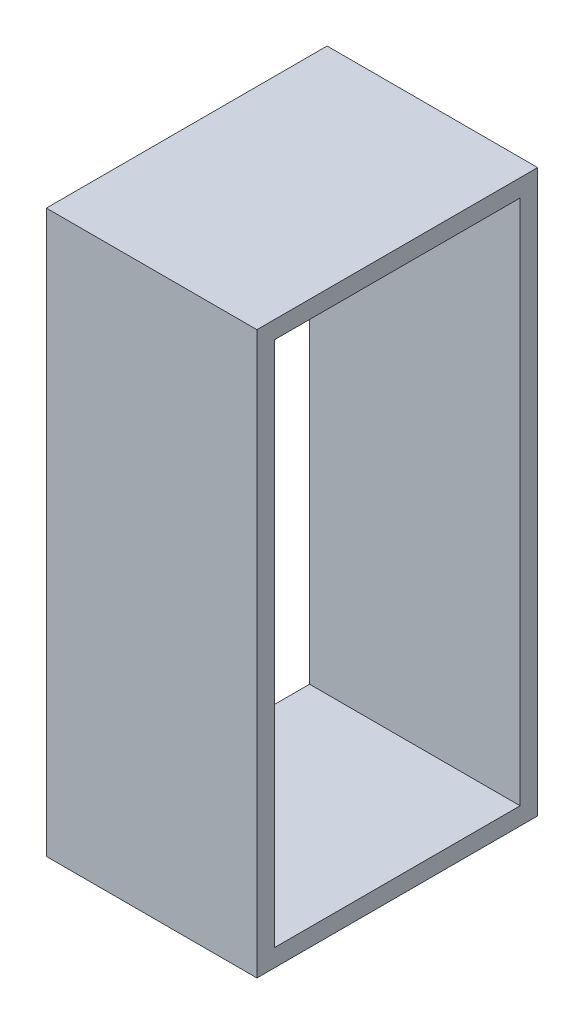
ISO-10303-21;
HEADER;
FILE_DESCRIPTION(('STEP AP214'),'2;1');
FILE_NAME('part.step','',(''),(''),'','','');
FILE_SCHEMA(('AUTOMOTIVE_DESIGN { 1 0 10303 214 1 1 1 1 }'));
ENDSEC;
DATA;
#1=APPLICATION_CONTEXT('core data for automotive mechanical design processes');
#2=APPLICATION_PROTOCOL_DEFINITION('international standard','automotive_design',2000,#1);
#3=PRODUCT_CONTEXT('',#1,'mechanical');
#4=PRODUCT('Part','Part','',(#3));
#5=PRODUCT_RELATED_PRODUCT_CATEGORY('part','',(#4));
#6=PRODUCT_DEFINITION_FORMATION('','',#4);
#7=PRODUCT_DEFINITION_CONTEXT('part definition',#1,'design');
#8=PRODUCT_DEFINITION('design','',#6,#7);
#9=PRODUCT_DEFINITION_SHAPE('','',#8);
#10=(LENGTH_UNIT() NAMED_UNIT(*) SI_UNIT(.MILLI.,.METRE.));
#11=(NAMED_UNIT(*) PLANE_ANGLE_UNIT() SI_UNIT($,.RADIAN.));
#12=(NAMED_UNIT(*) SI_UNIT($,.STERADIAN.) SOLID_ANGLE_UNIT());
#13=UNCERTAINTY_MEASURE_WITH_UNIT(LENGTH_MEASURE(1.E-05),#10,'distance_accuracy_value','');
#14=(GEOMETRIC_REPRESENTATION_CONTEXT(3) GLOBAL_UNCERTAINTY_ASSIGNED_CONTEXT((#13)) GLOBAL_UNIT_ASSIGNED_CONTEXT((#10,
#11,#12)) REPRESENTATION_CONTEXT('',''));
#15=CARTESIAN_POINT('',(0.,0.,0.));
#16=DIRECTION('',(0.,0.,1.));
#17=DIRECTION('',(1.,0.,0.));
#18=AXIS2_PLACEMENT_3D('',#15,#16,#17);
#19=CARTESIAN_POINT('',(19.05,0.,0.));
#20=DIRECTION('',(1.,0.,0.));
#21=DIRECTION('',(0.,0.,-1.));
#22=AXIS2_PLACEMENT_3D('',#19,#20,#21);
#23=PLANE('',#22);
#24=DIRECTION('',(0.,-1.,0.));
#25=VECTOR('',#24,1.);
#26=CARTESIAN_POINT('',(19.05,-25.4,12.7));
#27=LINE('',#26,#25);
#28=CARTESIAN_POINT('',(19.05,25.4,12.7));
#29=VERTEX_POINT('',#28);
#30=CARTESIAN_POINT('',(19.05,-25.4,12.7));
#31=VERTEX_POINT('',#30);
#32=EDGE_CURVE('E153',#29,#31,#27,.T.);
#33=ORIENTED_EDGE('',*,*,#32,.T.);
#34=DIRECTION('',(0.,0.,-1.));
#35=VECTOR('',#34,1.);
#36=CARTESIAN_POINT('',(19.05,-25.4,-12.7));
#37=LINE('',#36,#35);
#38=CARTESIAN_POINT('',(19.05,-25.4,-12.7));
#39=VERTEX_POINT('',#38);
#40=EDGE_CURVE('E157',#31,#39,#37,.T.);
#41=ORIENTED_EDGE('',*,*,#40,.T.);
#42=DIRECTION('',(0.,1.,0.));
#43=VECTOR('',#42,1.);
#44=CARTESIAN_POINT('',(19.05,-25.4,-12.7));
#45=LINE('',#44,#43);
#46=CARTESIAN_POINT('',(19.05,25.4,-12.7));
#47=VERTEX_POINT('',#46);
#48=EDGE_CURVE('E161',#39,#47,#45,.T.);
#49=ORIENTED_EDGE('',*,*,#48,.T.);
#50=DIRECTION('',(0.,0.,1.));
#51=VECTOR('',#50,1.);
#52=CARTESIAN_POINT('',(19.05,25.4,-12.7));
#53=LINE('',#52,#51);
#54=EDGE_CURVE('E164',#47,#29,#53,.T.);
#55=ORIENTED_EDGE('',*,*,#54,.T.);
#56=EDGE_LOOP('',(#33,#41,#49,#55));
#57=FACE_BOUND('',#56,.T.);
#58=DIRECTION('',(0.,0.,-1.));
#59=VECTOR('',#58,1.);
#60=CARTESIAN_POINT('',(19.05,-23.8125,-11.1125));
#61=LINE('',#60,#59);
#62=CARTESIAN_POINT('',(19.05,-23.8125,11.1125));
#63=VERTEX_POINT('',#62);
#64=CARTESIAN_POINT('',(19.05,-23.8125,-11.1125));
#65=VERTEX_POINT('',#64);
#66=EDGE_CURVE('E114',#63,#65,#61,.T.);
#67=ORIENTED_EDGE('',*,*,#66,.F.);
#68=DIRECTION('',(0.,-1.,0.));
#69=VECTOR('',#68,1.);
#70=CARTESIAN_POINT('',(19.05,-23.8125,11.1125));
#71=LINE('',#70,#69);
#72=CARTESIAN_POINT('',(19.05,23.8125,11.1125));
#73=VERTEX_POINT('',#72);
#74=EDGE_CURVE('E105',#73,#63,#71,.T.);
#75=ORIENTED_EDGE('',*,*,#74,.F.);
#76=DIRECTION('',(0.,0.,1.));
#77=VECTOR('',#76,1.);
#78=CARTESIAN_POINT('',(19.05,23.8125,-11.1125));
#79=LINE('',#78,#77);
#80=CARTESIAN_POINT('',(19.05,23.8125,-11.1125));
#81=VERTEX_POINT('',#80);
#82=EDGE_CURVE('E131',#81,#73,#79,.T.);
#83=ORIENTED_EDGE('',*,*,#82,.F.);
#84=DIRECTION('',(0.,1.,0.));
#85=VECTOR('',#84,1.);
#86=CARTESIAN_POINT('',(19.05,-23.8125,-11.1125));
#87=LINE('',#86,#85);
#88=EDGE_CURVE('E127',#65,#81,#87,.T.);
#89=ORIENTED_EDGE('',*,*,#88,.F.);
#90=EDGE_LOOP('',(#67,#75,#83,#89));
#91=FACE_BOUND('',#90,.T.);
#92=ADVANCED_FACE('F39',(#57,#91),#23,.T.);
#93=CARTESIAN_POINT('',(0.,0.,0.));
#94=DIRECTION('',(1.,0.,0.));
#95=DIRECTION('',(0.,0.,-1.));
#96=AXIS2_PLACEMENT_3D('',#93,#94,#95);
#97=PLANE('',#96);
#98=DIRECTION('',(0.,-1.,0.));
#99=VECTOR('',#98,1.);
#100=CARTESIAN_POINT('',(0.,-25.4,12.7));
#101=LINE('',#100,#99);
#102=CARTESIAN_POINT('',(0.,25.4,12.7));
#103=VERTEX_POINT('',#102);
#104=CARTESIAN_POINT('',(0.,-25.4,12.7));
#105=VERTEX_POINT('',#104);
#106=EDGE_CURVE('E123',#103,#105,#101,.T.);
#107=ORIENTED_EDGE('',*,*,#106,.F.);
#108=DIRECTION('',(0.,0.,1.));
#109=VECTOR('',#108,1.);
#110=CARTESIAN_POINT('',(0.,25.4,-12.7));
#111=LINE('',#110,#109);
#112=CARTESIAN_POINT('',(0.,25.4,-12.7));
#113=VERTEX_POINT('',#112);
#114=EDGE_CURVE('E158',#113,#103,#111,.T.);
#115=ORIENTED_EDGE('',*,*,#114,.F.);
#116=DIRECTION('',(0.,1.,0.));
#117=VECTOR('',#116,1.);
#118=CARTESIAN_POINT('',(0.,-25.4,-12.7));
#119=LINE('',#118,#117);
#120=CARTESIAN_POINT('',(0.,-25.4,-12.7));
#121=VERTEX_POINT('',#120);
#122=EDGE_CURVE('E174',#121,#113,#119,.T.);
#123=ORIENTED_EDGE('',*,*,#122,.F.);
#124=DIRECTION('',(0.,0.,-1.));
#125=VECTOR('',#124,1.);
#126=CARTESIAN_POINT('',(0.,-25.4,-12.7));
#127=LINE('',#126,#125);
#128=EDGE_CURVE('E171',#105,#121,#127,.T.);
#129=ORIENTED_EDGE('',*,*,#128,.F.);
#130=EDGE_LOOP('',(#107,#115,#123,#129));
#131=FACE_BOUND('',#130,.T.);
#132=DIRECTION('',(0.,-1.,0.));
#133=VECTOR('',#132,1.);
#134=CARTESIAN_POINT('',(0.,-23.8125,11.1125));
#135=LINE('',#134,#133);
#136=CARTESIAN_POINT('',(0.,23.8125,11.1125));
#137=VERTEX_POINT('',#136);
#138=CARTESIAN_POINT('',(0.,-23.8125,11.1125));
#139=VERTEX_POINT('',#138);
#140=EDGE_CURVE('E63',#137,#139,#135,.T.);
#141=ORIENTED_EDGE('',*,*,#140,.T.);
#142=DIRECTION('',(0.,0.,-1.));
#143=VECTOR('',#142,1.);
#144=CARTESIAN_POINT('',(0.,-23.8125,-11.1125));
#145=LINE('',#144,#143);
#146=CARTESIAN_POINT('',(0.,-23.8125,-11.1125));
#147=VERTEX_POINT('',#146);
#148=EDGE_CURVE('E121',#139,#147,#145,.T.);
#149=ORIENTED_EDGE('',*,*,#148,.T.);
#150=DIRECTION('',(0.,1.,0.));
#151=VECTOR('',#150,1.);
#152=CARTESIAN_POINT('',(0.,-23.8125,-11.1125));
#153=LINE('',#152,#151);
#154=CARTESIAN_POINT('',(0.,23.8125,-11.1125));
#155=VERTEX_POINT('',#154);
#156=EDGE_CURVE('E140',#147,#155,#153,.T.);
#157=ORIENTED_EDGE('',*,*,#156,.T.);
#158=DIRECTION('',(0.,0.,1.));
#159=VECTOR('',#158,1.);
#160=CARTESIAN_POINT('',(0.,23.8125,-11.1125));
#161=LINE('',#160,#159);
#162=EDGE_CURVE('E115',#155,#137,#161,.T.);
#163=ORIENTED_EDGE('',*,*,#162,.T.);
#164=EDGE_LOOP('',(#141,#149,#157,#163));
#165=FACE_BOUND('',#164,.T.);
#166=ADVANCED_FACE('F197',(#131,#165),#97,.F.);
#167=CARTESIAN_POINT('',(19.05,-25.4,12.7));
#168=DIRECTION('',(0.,0.,-1.));
#169=DIRECTION('',(-1.,0.,0.));
#170=AXIS2_PLACEMENT_3D('',#167,#168,#169);
#171=PLANE('',#170);
#172=ORIENTED_EDGE('',*,*,#106,.T.);
#173=DIRECTION('',(-1.,0.,0.));
#174=VECTOR('',#173,1.);
#175=CARTESIAN_POINT('',(19.05,-25.4,12.7));
#176=LINE('',#175,#174);
#177=EDGE_CURVE('E11',#31,#105,#176,.T.);
#178=ORIENTED_EDGE('',*,*,#177,.F.);
#179=ORIENTED_EDGE('',*,*,#32,.F.);
#180=DIRECTION('',(-1.,0.,0.));
#181=VECTOR('',#180,1.);
#182=CARTESIAN_POINT('',(19.05,25.4,12.7));
#183=LINE('',#182,#181);
#184=EDGE_CURVE('E167',#29,#103,#183,.T.);
#185=ORIENTED_EDGE('',*,*,#184,.T.);
#186=EDGE_LOOP('',(#172,#178,#179,#185));
#187=FACE_BOUND('',#186,.T.);
#188=ADVANCED_FACE('F41',(#187),#171,.F.);
#189=CARTESIAN_POINT('',(19.05,-25.4,-12.7));
#190=DIRECTION('',(0.,1.,0.));
#191=DIRECTION('',(0.,0.,1.));
#192=AXIS2_PLACEMENT_3D('',#189,#190,#191);
#193=PLANE('',#192);
#194=ORIENTED_EDGE('',*,*,#128,.T.);
#195=DIRECTION('',(-1.,0.,0.));
#196=VECTOR('',#195,1.);
#197=CARTESIAN_POINT('',(19.05,-25.4,-12.7));
#198=LINE('',#197,#196);
#199=EDGE_CURVE('E48',#39,#121,#198,.T.);
#200=ORIENTED_EDGE('',*,*,#199,.F.);
#201=ORIENTED_EDGE('',*,*,#40,.F.);
#202=ORIENTED_EDGE('',*,*,#177,.T.);
#203=EDGE_LOOP('',(#194,#200,#201,#202));
#204=FACE_BOUND('',#203,.T.);
#205=ADVANCED_FACE('F207',(#204),#193,.F.);
#206=CARTESIAN_POINT('',(19.05,-25.4,-12.7));
#207=DIRECTION('',(0.,0.,1.));
#208=DIRECTION('',(1.,0.,0.));
#209=AXIS2_PLACEMENT_3D('',#206,#207,#208);
#210=PLANE('',#209);
#211=ORIENTED_EDGE('',*,*,#122,.T.);
#212=DIRECTION('',(-1.,0.,0.));
#213=VECTOR('',#212,1.);
#214=CARTESIAN_POINT('',(19.05,25.4,-12.7));
#215=LINE('',#214,#213);
#216=EDGE_CURVE('E182',#47,#113,#215,.T.);
#217=ORIENTED_EDGE('',*,*,#216,.F.);
#218=ORIENTED_EDGE('',*,*,#48,.F.);
#219=ORIENTED_EDGE('',*,*,#199,.T.);
#220=EDGE_LOOP('',(#211,#217,#218,#219));
#221=FACE_BOUND('',#220,.T.);
#222=ADVANCED_FACE('F191',(#221),#210,.F.);
#223=CARTESIAN_POINT('',(19.05,25.4,-12.7));
#224=DIRECTION('',(0.,-1.,0.));
#225=DIRECTION('',(0.,0.,-1.));
#226=AXIS2_PLACEMENT_3D('',#223,#224,#225);
#227=PLANE('',#226);
#228=ORIENTED_EDGE('',*,*,#114,.T.);
#229=ORIENTED_EDGE('',*,*,#184,.F.);
#230=ORIENTED_EDGE('',*,*,#54,.F.);
#231=ORIENTED_EDGE('',*,*,#216,.T.);
#232=EDGE_LOOP('',(#228,#229,#230,#231));
#233=FACE_BOUND('',#232,.T.);
#234=ADVANCED_FACE('F201',(#233),#227,.F.);
#235=CARTESIAN_POINT('',(19.05,-23.8125,11.1125));
#236=DIRECTION('',(0.,0.,-1.));
#237=DIRECTION('',(-1.,0.,0.));
#238=AXIS2_PLACEMENT_3D('',#235,#236,#237);
#239=PLANE('',#238);
#240=ORIENTED_EDGE('',*,*,#140,.F.);
#241=DIRECTION('',(-1.,0.,0.));
#242=VECTOR('',#241,1.);
#243=CARTESIAN_POINT('',(19.05,23.8125,11.1125));
#244=LINE('',#243,#242);
#245=EDGE_CURVE('E109',#73,#137,#244,.T.);
#246=ORIENTED_EDGE('',*,*,#245,.F.);
#247=ORIENTED_EDGE('',*,*,#74,.T.);
#248=DIRECTION('',(-1.,0.,0.));
#249=VECTOR('',#248,1.);
#250=CARTESIAN_POINT('',(19.05,-23.8125,11.1125));
#251=LINE('',#250,#249);
#252=EDGE_CURVE('E108',#63,#139,#251,.T.);
#253=ORIENTED_EDGE('',*,*,#252,.T.);
#254=EDGE_LOOP('',(#240,#246,#247,#253));
#255=FACE_BOUND('',#254,.T.);
#256=ADVANCED_FACE('F107',(#255),#239,.T.);
#257=CARTESIAN_POINT('',(19.05,-23.8125,-11.1125));
#258=DIRECTION('',(0.,1.,0.));
#259=DIRECTION('',(0.,0.,1.));
#260=AXIS2_PLACEMENT_3D('',#257,#258,#259);
#261=PLANE('',#260);
#262=ORIENTED_EDGE('',*,*,#148,.F.);
#263=ORIENTED_EDGE('',*,*,#252,.F.);
#264=ORIENTED_EDGE('',*,*,#66,.T.);
#265=DIRECTION('',(-1.,0.,0.));
#266=VECTOR('',#265,1.);
#267=CARTESIAN_POINT('',(19.05,-23.8125,-11.1125));
#268=LINE('',#267,#266);
#269=EDGE_CURVE('E124',#65,#147,#268,.T.);
#270=ORIENTED_EDGE('',*,*,#269,.T.);
#271=EDGE_LOOP('',(#262,#263,#264,#270));
#272=FACE_BOUND('',#271,.T.);
#273=ADVANCED_FACE('F118',(#272),#261,.T.);
#274=CARTESIAN_POINT('',(19.05,-23.8125,-11.1125));
#275=DIRECTION('',(0.,0.,1.));
#276=DIRECTION('',(1.,0.,0.));
#277=AXIS2_PLACEMENT_3D('',#274,#275,#276);
#278=PLANE('',#277);
#279=ORIENTED_EDGE('',*,*,#156,.F.);
#280=ORIENTED_EDGE('',*,*,#269,.F.);
#281=ORIENTED_EDGE('',*,*,#88,.T.);
#282=DIRECTION('',(-1.,0.,0.));
#283=VECTOR('',#282,1.);
#284=CARTESIAN_POINT('',(19.05,23.8125,-11.1125));
#285=LINE('',#284,#283);
#286=EDGE_CURVE('E55',#81,#155,#285,.T.);
#287=ORIENTED_EDGE('',*,*,#286,.T.);
#288=EDGE_LOOP('',(#279,#280,#281,#287));
#289=FACE_BOUND('',#288,.T.);
#290=ADVANCED_FACE('F230',(#289),#278,.T.);
#291=CARTESIAN_POINT('',(19.05,23.8125,-11.1125));
#292=DIRECTION('',(0.,-1.,0.));
#293=DIRECTION('',(0.,0.,-1.));
#294=AXIS2_PLACEMENT_3D('',#291,#292,#293);
#295=PLANE('',#294);
#296=ORIENTED_EDGE('',*,*,#162,.F.);
#297=ORIENTED_EDGE('',*,*,#286,.F.);
#298=ORIENTED_EDGE('',*,*,#82,.T.);
#299=ORIENTED_EDGE('',*,*,#245,.T.);
#300=EDGE_LOOP('',(#296,#297,#298,#299));
#301=FACE_BOUND('',#300,.T.);
#302=ADVANCED_FACE('F234',(#301),#295,.T.);
#303=CLOSED_SHELL('',(#92,#166,#188,#205,#222,#234,#256,#273,#290,#302));
#304=MANIFOLD_SOLID_BREP('B2',#303);
#305=ADVANCED_BREP_SHAPE_REPRESENTATION('',(#18,#304),#14);
#306=SHAPE_DEFINITION_REPRESENTATION(#9,#305);
ENDSEC;
END-ISO-10303-21;
